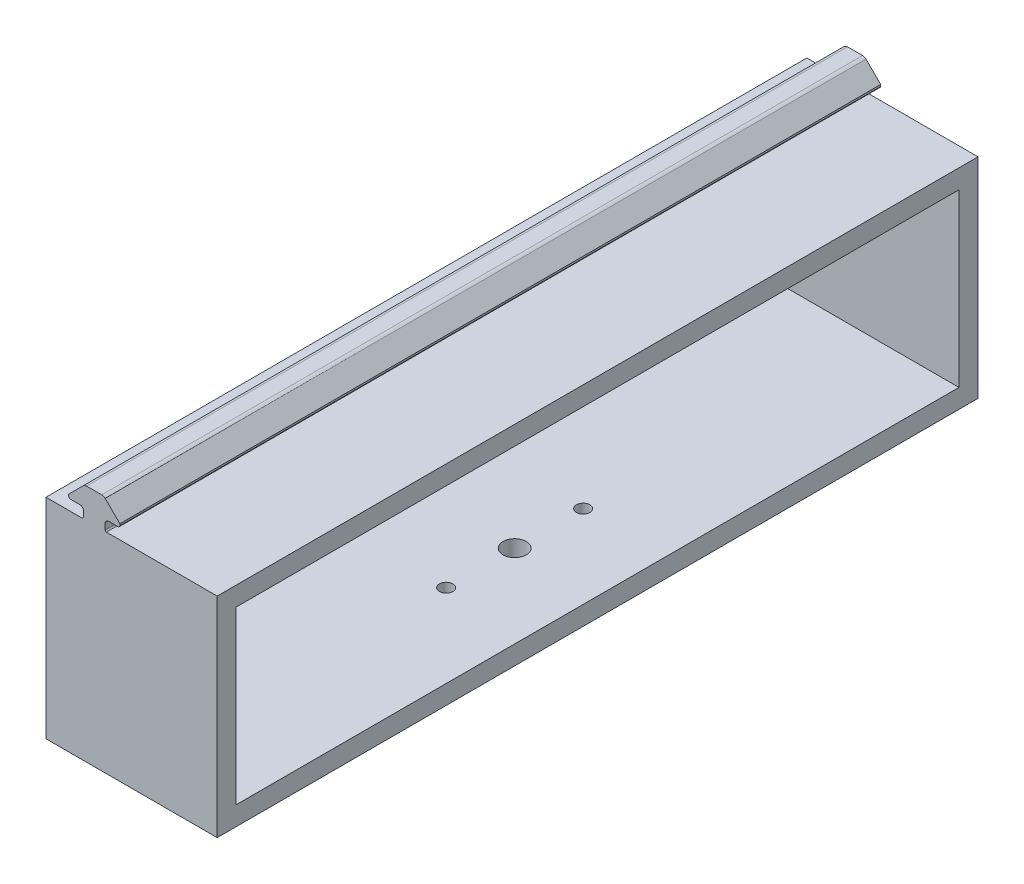
ISO-10303-21;
HEADER;
FILE_DESCRIPTION(('STEP AP214'),'2;1');
FILE_NAME('part.step','',(''),(''),'','','');
FILE_SCHEMA(('AUTOMOTIVE_DESIGN { 1 0 10303 214 1 1 1 1 }'));
ENDSEC;
DATA;
#1=APPLICATION_CONTEXT('core data for automotive mechanical design processes');
#2=APPLICATION_PROTOCOL_DEFINITION('international standard','automotive_design',2000,#1);
#3=PRODUCT_CONTEXT('',#1,'mechanical');
#4=PRODUCT('Part','Part','',(#3));
#5=PRODUCT_RELATED_PRODUCT_CATEGORY('part','',(#4));
#6=PRODUCT_DEFINITION_FORMATION('','',#4);
#7=PRODUCT_DEFINITION_CONTEXT('part definition',#1,'design');
#8=PRODUCT_DEFINITION('design','',#6,#7);
#9=PRODUCT_DEFINITION_SHAPE('','',#8);
#10=(LENGTH_UNIT() NAMED_UNIT(*) SI_UNIT(.MILLI.,.METRE.));
#11=(NAMED_UNIT(*) PLANE_ANGLE_UNIT() SI_UNIT($,.RADIAN.));
#12=(NAMED_UNIT(*) SI_UNIT($,.STERADIAN.) SOLID_ANGLE_UNIT());
#13=UNCERTAINTY_MEASURE_WITH_UNIT(LENGTH_MEASURE(1.E-05),#10,'distance_accuracy_value','');
#14=(GEOMETRIC_REPRESENTATION_CONTEXT(3) GLOBAL_UNCERTAINTY_ASSIGNED_CONTEXT((#13)) GLOBAL_UNIT_ASSIGNED_CONTEXT((#10,
#11,#12)) REPRESENTATION_CONTEXT('',''));
#15=CARTESIAN_POINT('',(0.,0.,0.));
#16=DIRECTION('',(0.,0.,1.));
#17=DIRECTION('',(1.,0.,0.));
#18=AXIS2_PLACEMENT_3D('',#15,#16,#17);
#19=CARTESIAN_POINT('',(-8.1958693909758,29.0682575839623,200.));
#20=DIRECTION('',(0.,0.,-1.));
#21=DIRECTION('',(-1.,0.,0.));
#22=AXIS2_PLACEMENT_3D('',#19,#20,#21);
#23=CYLINDRICAL_SURFACE('',#22,2.2572718680956);
#24=CARTESIAN_POINT('',(-8.1958693909758,29.0682575839623,0.));
#25=DIRECTION('',(0.,0.,1.));
#26=DIRECTION('',(-1.,0.,0.));
#27=AXIS2_PLACEMENT_3D('',#24,#25,#26);
#28=CIRCLE('',#27,2.2572718680956);
#29=CARTESIAN_POINT('',(-6.93784845917179,30.9424666495787,0.));
#30=VERTEX_POINT('',#29);
#31=CARTESIAN_POINT('',(-7.83541703649035,31.2965642025949,0.));
#32=VERTEX_POINT('',#31);
#33=EDGE_CURVE('E255',#30,#32,#28,.T.);
#34=ORIENTED_EDGE('',*,*,#33,.T.);
#35=DIRECTION('',(0.,0.,-1.));
#36=VECTOR('',#35,1.);
#37=CARTESIAN_POINT('',(-7.83541703649035,31.2965642025949,200.));
#38=LINE('',#37,#36);
#39=CARTESIAN_POINT('',(-7.83541703649035,31.2965642025949,200.));
#40=VERTEX_POINT('',#39);
#41=EDGE_CURVE('E479',#40,#32,#38,.T.);
#42=ORIENTED_EDGE('',*,*,#41,.F.);
#43=CARTESIAN_POINT('',(-8.1958693909758,29.0682575839623,200.));
#44=DIRECTION('',(0.,0.,1.));
#45=DIRECTION('',(-1.,0.,0.));
#46=AXIS2_PLACEMENT_3D('',#43,#44,#45);
#47=CIRCLE('',#46,2.2572718680956);
#48=CARTESIAN_POINT('',(-6.93784845917179,30.9424666495787,200.));
#49=VERTEX_POINT('',#48);
#50=EDGE_CURVE('E262',#49,#40,#47,.T.);
#51=ORIENTED_EDGE('',*,*,#50,.F.);
#52=DIRECTION('',(0.,0.,-1.));
#53=VECTOR('',#52,1.);
#54=CARTESIAN_POINT('',(-6.93784845917179,30.9424666495787,200.));
#55=LINE('',#54,#53);
#56=EDGE_CURVE('E330',#49,#30,#55,.T.);
#57=ORIENTED_EDGE('',*,*,#56,.T.);
#58=EDGE_LOOP('',(#34,#42,#51,#57));
#59=FACE_BOUND('',#58,.T.);
#60=ADVANCED_FACE('F45',(#59),#23,.T.);
#61=CARTESIAN_POINT('',(-11.79278840289,31.2965642025949,200.));
#62=DIRECTION('',(0.,-1.,0.));
#63=DIRECTION('',(0.,0.,-1.));
#64=AXIS2_PLACEMENT_3D('',#61,#62,#63);
#65=PLANE('',#64);
#66=DIRECTION('',(-1.,0.,0.));
#67=VECTOR('',#66,1.);
#68=CARTESIAN_POINT('',(-11.79278840289,31.2965642025949,0.));
#69=LINE('',#68,#67);
#70=CARTESIAN_POINT('',(-11.79278840289,31.2965642025949,0.));
#71=VERTEX_POINT('',#70);
#72=EDGE_CURVE('E334',#32,#71,#69,.T.);
#73=ORIENTED_EDGE('',*,*,#72,.T.);
#74=DIRECTION('',(0.,0.,-1.));
#75=VECTOR('',#74,1.);
#76=CARTESIAN_POINT('',(-11.79278840289,31.2965642025949,200.));
#77=LINE('',#76,#75);
#78=CARTESIAN_POINT('',(-11.79278840289,31.2965642025949,200.));
#79=VERTEX_POINT('',#78);
#80=EDGE_CURVE('E475',#79,#71,#77,.T.);
#81=ORIENTED_EDGE('',*,*,#80,.F.);
#82=DIRECTION('',(-1.,0.,0.));
#83=VECTOR('',#82,1.);
#84=CARTESIAN_POINT('',(-11.79278840289,31.2965642025949,200.));
#85=LINE('',#84,#83);
#86=EDGE_CURVE('E266',#40,#79,#85,.T.);
#87=ORIENTED_EDGE('',*,*,#86,.F.);
#88=ORIENTED_EDGE('',*,*,#41,.T.);
#89=EDGE_LOOP('',(#73,#81,#87,#88));
#90=FACE_BOUND('',#89,.T.);
#91=ADVANCED_FACE('F519',(#90),#65,.F.);
#92=CARTESIAN_POINT('',(-11.4323360484045,29.0682575839623,200.));
#93=DIRECTION('',(0.,0.,-1.));
#94=DIRECTION('',(-1.,0.,0.));
#95=AXIS2_PLACEMENT_3D('',#92,#93,#94);
#96=CYLINDRICAL_SURFACE('',#95,2.2572718680956);
#97=CARTESIAN_POINT('',(-11.4323360484045,29.0682575839623,0.));
#98=DIRECTION('',(0.,0.,1.));
#99=DIRECTION('',(1.,0.,0.));
#100=AXIS2_PLACEMENT_3D('',#97,#98,#99);
#101=CIRCLE('',#100,2.2572718680956);
#102=CARTESIAN_POINT('',(-12.6903569802085,30.9424666495787,0.));
#103=VERTEX_POINT('',#102);
#104=EDGE_CURVE('E337',#71,#103,#101,.T.);
#105=ORIENTED_EDGE('',*,*,#104,.T.);
#106=DIRECTION('',(0.,0.,-1.));
#107=VECTOR('',#106,1.);
#108=CARTESIAN_POINT('',(-12.6903569802085,30.9424666495787,200.));
#109=LINE('',#108,#107);
#110=CARTESIAN_POINT('',(-12.6903569802085,30.9424666495787,200.));
#111=VERTEX_POINT('',#110);
#112=EDGE_CURVE('E471',#111,#103,#109,.T.);
#113=ORIENTED_EDGE('',*,*,#112,.F.);
#114=CARTESIAN_POINT('',(-11.4323360484045,29.0682575839623,200.));
#115=DIRECTION('',(0.,0.,1.));
#116=DIRECTION('',(1.,0.,0.));
#117=AXIS2_PLACEMENT_3D('',#114,#115,#116);
#118=CIRCLE('',#117,2.2572718680956);
#119=EDGE_CURVE('E270',#79,#111,#118,.T.);
#120=ORIENTED_EDGE('',*,*,#119,.F.);
#121=ORIENTED_EDGE('',*,*,#80,.T.);
#122=EDGE_LOOP('',(#105,#113,#120,#121));
#123=FACE_BOUND('',#122,.T.);
#124=ADVANCED_FACE('F524',(#123),#96,.T.);
#125=CARTESIAN_POINT('',(-12.6903569802085,30.9424666495787,200.));
#126=DIRECTION('',(0.707106781186547,-0.707106781186547,0.));
#127=DIRECTION('',(0.707106781186548,0.707106781186548,0.));
#128=AXIS2_PLACEMENT_3D('',#125,#126,#127);
#129=PLANE('',#128);
#130=DIRECTION('',(-0.707106781186547,-0.707106781186547,0.));
#131=VECTOR('',#130,1.);
#132=CARTESIAN_POINT('',(-12.6903569802085,30.9424666495787,0.));
#133=LINE('',#132,#131);
#134=CARTESIAN_POINT('',(-16.5448242417791,27.0879993880081,0.));
#135=VERTEX_POINT('',#134);
#136=EDGE_CURVE('E340',#103,#135,#133,.T.);
#137=ORIENTED_EDGE('',*,*,#136,.T.);
#138=DIRECTION('',(0.,0.,-1.));
#139=VECTOR('',#138,1.);
#140=CARTESIAN_POINT('',(-16.5448242417791,27.0879993880081,200.));
#141=LINE('',#140,#139);
#142=CARTESIAN_POINT('',(-16.5448242417791,27.0879993880081,200.));
#143=VERTEX_POINT('',#142);
#144=EDGE_CURVE('E467',#143,#135,#141,.T.);
#145=ORIENTED_EDGE('',*,*,#144,.F.);
#146=DIRECTION('',(-0.707106781186547,-0.707106781186547,0.));
#147=VECTOR('',#146,1.);
#148=CARTESIAN_POINT('',(-12.6903569802085,30.9424666495787,200.));
#149=LINE('',#148,#147);
#150=EDGE_CURVE('E273',#111,#143,#149,.T.);
#151=ORIENTED_EDGE('',*,*,#150,.F.);
#152=ORIENTED_EDGE('',*,*,#112,.T.);
#153=EDGE_LOOP('',(#137,#145,#151,#152));
#154=FACE_BOUND('',#153,.T.);
#155=ADVANCED_FACE('F628',(#154),#129,.F.);
#156=CARTESIAN_POINT('',(-16.5448242417791,27.0879993880081,200.));
#157=DIRECTION('',(1.,0.,0.));
#158=DIRECTION('',(0.,0.,-1.));
#159=AXIS2_PLACEMENT_3D('',#156,#157,#158);
#160=PLANE('',#159);
#161=DIRECTION('',(0.,-1.,0.));
#162=VECTOR('',#161,1.);
#163=CARTESIAN_POINT('',(-16.5448242417791,27.0879993880081,0.));
#164=LINE('',#163,#162);
#165=CARTESIAN_POINT('',(-16.5448242417791,26.6272076199878,0.));
#166=VERTEX_POINT('',#165);
#167=EDGE_CURVE('E343',#135,#166,#164,.T.);
#168=ORIENTED_EDGE('',*,*,#167,.T.);
#169=DIRECTION('',(0.,0.,-1.));
#170=VECTOR('',#169,1.);
#171=CARTESIAN_POINT('',(-16.5448242417791,26.6272076199878,200.));
#172=LINE('',#171,#170);
#173=CARTESIAN_POINT('',(-16.5448242417791,26.6272076199878,200.));
#174=VERTEX_POINT('',#173);
#175=EDGE_CURVE('E463',#174,#166,#172,.T.);
#176=ORIENTED_EDGE('',*,*,#175,.F.);
#177=DIRECTION('',(0.,-1.,0.));
#178=VECTOR('',#177,1.);
#179=CARTESIAN_POINT('',(-16.5448242417791,27.0879993880081,200.));
#180=LINE('',#179,#178);
#181=EDGE_CURVE('E276',#143,#174,#180,.T.);
#182=ORIENTED_EDGE('',*,*,#181,.F.);
#183=ORIENTED_EDGE('',*,*,#144,.T.);
#184=EDGE_LOOP('',(#168,#176,#182,#183));
#185=FACE_BOUND('',#184,.T.);
#186=ADVANCED_FACE('F623',(#185),#160,.F.);
#187=CARTESIAN_POINT('',(-15.9493391101866,26.76190098356,200.));
#188=DIRECTION('',(0.,0.,-1.));
#189=DIRECTION('',(-1.,0.,0.));
#190=AXIS2_PLACEMENT_3D('',#187,#188,#189);
#191=CYLINDRICAL_SURFACE('',#190,0.610528331970121);
#192=CARTESIAN_POINT('',(-15.9493391101866,26.76190098356,0.));
#193=DIRECTION('',(0.,0.,1.));
#194=DIRECTION('',(-1.,0.,0.));
#195=AXIS2_PLACEMENT_3D('',#192,#193,#194);
#196=CIRCLE('',#195,0.610528331970121);
#197=CARTESIAN_POINT('',(-16.0840324737598,26.1664158519676,0.));
#198=VERTEX_POINT('',#197);
#199=EDGE_CURVE('E346',#166,#198,#196,.T.);
#200=ORIENTED_EDGE('',*,*,#199,.T.);
#201=DIRECTION('',(0.,0.,-1.));
#202=VECTOR('',#201,1.);
#203=CARTESIAN_POINT('',(-16.0840324737598,26.1664158519676,200.));
#204=LINE('',#203,#202);
#205=CARTESIAN_POINT('',(-16.0840324737598,26.1664158519676,200.));
#206=VERTEX_POINT('',#205);
#207=EDGE_CURVE('E459',#206,#198,#204,.T.);
#208=ORIENTED_EDGE('',*,*,#207,.F.);
#209=CARTESIAN_POINT('',(-15.9493391101866,26.76190098356,200.));
#210=DIRECTION('',(0.,0.,1.));
#211=DIRECTION('',(-1.,0.,0.));
#212=AXIS2_PLACEMENT_3D('',#209,#210,#211);
#213=CIRCLE('',#212,0.610528331970121);
#214=EDGE_CURVE('E279',#174,#206,#213,.T.);
#215=ORIENTED_EDGE('',*,*,#214,.F.);
#216=ORIENTED_EDGE('',*,*,#175,.T.);
#217=EDGE_LOOP('',(#200,#208,#215,#216));
#218=FACE_BOUND('',#217,.T.);
#219=ADVANCED_FACE('F619',(#218),#191,.T.);
#220=CARTESIAN_POINT('',(-16.0840324737598,26.1664158519676,200.));
#221=DIRECTION('',(0.,1.,0.));
#222=DIRECTION('',(0.,0.,1.));
#223=AXIS2_PLACEMENT_3D('',#220,#221,#222);
#224=PLANE('',#223);
#225=DIRECTION('',(1.,0.,0.));
#226=VECTOR('',#225,1.);
#227=CARTESIAN_POINT('',(-16.0840324737598,26.1664158519676,0.));
#228=LINE('',#227,#226);
#229=CARTESIAN_POINT('',(-13.5343180240455,26.1664158519676,0.));
#230=VERTEX_POINT('',#229);
#231=EDGE_CURVE('E349',#198,#230,#228,.T.);
#232=ORIENTED_EDGE('',*,*,#231,.T.);
#233=DIRECTION('',(0.,0.,-1.));
#234=VECTOR('',#233,1.);
#235=CARTESIAN_POINT('',(-13.5343180240455,26.1664158519676,200.));
#236=LINE('',#235,#234);
#237=CARTESIAN_POINT('',(-13.5343180240455,26.1664158519676,200.));
#238=VERTEX_POINT('',#237);
#239=EDGE_CURVE('E455',#238,#230,#236,.T.);
#240=ORIENTED_EDGE('',*,*,#239,.F.);
#241=DIRECTION('',(1.,0.,0.));
#242=VECTOR('',#241,1.);
#243=CARTESIAN_POINT('',(-16.0840324737598,26.1664158519676,200.));
#244=LINE('',#243,#242);
#245=EDGE_CURVE('E282',#206,#238,#244,.T.);
#246=ORIENTED_EDGE('',*,*,#245,.F.);
#247=ORIENTED_EDGE('',*,*,#207,.T.);
#248=EDGE_LOOP('',(#232,#240,#246,#247));
#249=FACE_BOUND('',#248,.T.);
#250=ADVANCED_FACE('F615',(#249),#224,.F.);
#251=CARTESIAN_POINT('',(-13.5577695445467,25.2990032876291,200.));
#252=DIRECTION('',(0.,0.,-1.));
#253=DIRECTION('',(-1.,0.,0.));
#254=AXIS2_PLACEMENT_3D('',#251,#252,#253);
#255=CYLINDRICAL_SURFACE('',#254,0.867729526169411);
#256=CARTESIAN_POINT('',(-13.5577695445467,25.2990032876291,0.));
#257=DIRECTION('',(0.,0.,-1.));
#258=DIRECTION('',(-1.,0.,0.));
#259=AXIS2_PLACEMENT_3D('',#256,#257,#258);
#260=CIRCLE('',#259,0.867729526169411);
#261=CARTESIAN_POINT('',(-12.6903569802084,25.3224548081423,0.));
#262=VERTEX_POINT('',#261);
#263=EDGE_CURVE('E352',#230,#262,#260,.T.);
#264=ORIENTED_EDGE('',*,*,#263,.T.);
#265=DIRECTION('',(0.,0.,-1.));
#266=VECTOR('',#265,1.);
#267=CARTESIAN_POINT('',(-12.6903569802084,25.3224548081423,200.));
#268=LINE('',#267,#266);
#269=CARTESIAN_POINT('',(-12.6903569802084,25.3224548081423,200.));
#270=VERTEX_POINT('',#269);
#271=EDGE_CURVE('E451',#270,#262,#268,.T.);
#272=ORIENTED_EDGE('',*,*,#271,.F.);
#273=CARTESIAN_POINT('',(-13.5577695445467,25.2990032876291,200.));
#274=DIRECTION('',(0.,0.,-1.));
#275=DIRECTION('',(-1.,0.,0.));
#276=AXIS2_PLACEMENT_3D('',#273,#274,#275);
#277=CIRCLE('',#276,0.867729526169411);
#278=EDGE_CURVE('E285',#238,#270,#277,.T.);
#279=ORIENTED_EDGE('',*,*,#278,.F.);
#280=ORIENTED_EDGE('',*,*,#239,.T.);
#281=EDGE_LOOP('',(#264,#272,#279,#280));
#282=FACE_BOUND('',#281,.T.);
#283=ADVANCED_FACE('F610',(#282),#255,.F.);
#284=CARTESIAN_POINT('',(-12.6903569802084,25.3224548081423,200.));
#285=DIRECTION('',(1.,0.,0.));
#286=DIRECTION('',(0.,0.,-1.));
#287=AXIS2_PLACEMENT_3D('',#284,#285,#286);
#288=PLANE('',#287);
#289=DIRECTION('',(0.,-1.,0.));
#290=VECTOR('',#289,1.);
#291=CARTESIAN_POINT('',(-12.6903569802084,25.3224548081423,0.));
#292=LINE('',#291,#290);
#293=CARTESIAN_POINT('',(-12.6903569802084,23.7712461375488,0.));
#294=VERTEX_POINT('',#293);
#295=EDGE_CURVE('E355',#262,#294,#292,.T.);
#296=ORIENTED_EDGE('',*,*,#295,.T.);
#297=DIRECTION('',(0.,0.,-1.));
#298=VECTOR('',#297,1.);
#299=CARTESIAN_POINT('',(-12.6903569802084,23.7712461375488,200.));
#300=LINE('',#299,#298);
#301=CARTESIAN_POINT('',(-12.6903569802084,23.7712461375488,200.));
#302=VERTEX_POINT('',#301);
#303=EDGE_CURVE('E447',#302,#294,#300,.T.);
#304=ORIENTED_EDGE('',*,*,#303,.F.);
#305=DIRECTION('',(0.,-1.,0.));
#306=VECTOR('',#305,1.);
#307=CARTESIAN_POINT('',(-12.6903569802084,25.3224548081423,200.));
#308=LINE('',#307,#306);
#309=EDGE_CURVE('E288',#270,#302,#308,.T.);
#310=ORIENTED_EDGE('',*,*,#309,.F.);
#311=ORIENTED_EDGE('',*,*,#271,.T.);
#312=EDGE_LOOP('',(#296,#304,#310,#311));
#313=FACE_BOUND('',#312,.T.);
#314=ADVANCED_FACE('F604',(#313),#288,.F.);
#315=CARTESIAN_POINT('',(-13.069533531626,23.7783799229022,200.));
#316=DIRECTION('',(0.,0.,-1.));
#317=DIRECTION('',(-1.,0.,0.));
#318=AXIS2_PLACEMENT_3D('',#315,#316,#317);
#319=CYLINDRICAL_SURFACE('',#318,0.379243652601272);
#320=CARTESIAN_POINT('',(-13.069533531626,23.7783799229022,0.));
#321=DIRECTION('',(0.,0.,-1.));
#322=DIRECTION('',(-1.,0.,0.));
#323=AXIS2_PLACEMENT_3D('',#320,#321,#322);
#324=CIRCLE('',#323,0.379243652601272);
#325=CARTESIAN_POINT('',(-12.9823764886323,23.4092872544638,0.));
#326=VERTEX_POINT('',#325);
#327=EDGE_CURVE('E358',#294,#326,#324,.T.);
#328=ORIENTED_EDGE('',*,*,#327,.T.);
#329=DIRECTION('',(0.,0.,-1.));
#330=VECTOR('',#329,1.);
#331=CARTESIAN_POINT('',(-12.9823764886323,23.4092872544638,200.));
#332=LINE('',#331,#330);
#333=CARTESIAN_POINT('',(-12.9823764886323,23.4092872544638,200.));
#334=VERTEX_POINT('',#333);
#335=EDGE_CURVE('E443',#334,#326,#332,.T.);
#336=ORIENTED_EDGE('',*,*,#335,.F.);
#337=CARTESIAN_POINT('',(-13.069533531626,23.7783799229022,200.));
#338=DIRECTION('',(0.,0.,-1.));
#339=DIRECTION('',(-1.,0.,0.));
#340=AXIS2_PLACEMENT_3D('',#337,#338,#339);
#341=CIRCLE('',#340,0.379243652601272);
#342=EDGE_CURVE('E291',#302,#334,#341,.T.);
#343=ORIENTED_EDGE('',*,*,#342,.F.);
#344=ORIENTED_EDGE('',*,*,#303,.T.);
#345=EDGE_LOOP('',(#328,#336,#343,#344));
#346=FACE_BOUND('',#345,.T.);
#347=ADVANCED_FACE('F600',(#346),#319,.F.);
#348=CARTESIAN_POINT('',(-12.9823764886323,23.4092872544638,200.));
#349=DIRECTION('',(0.,-1.,0.));
#350=DIRECTION('',(0.,0.,-1.));
#351=AXIS2_PLACEMENT_3D('',#348,#349,#350);
#352=PLANE('',#351);
#353=DIRECTION('',(-1.,0.,0.));
#354=VECTOR('',#353,1.);
#355=CARTESIAN_POINT('',(-12.9823764886323,23.4092872544638,0.));
#356=LINE('',#355,#354);
#357=CARTESIAN_POINT('',(-22.5,23.4092872544638,0.));
#358=VERTEX_POINT('',#357);
#359=EDGE_CURVE('E361',#326,#358,#356,.T.);
#360=ORIENTED_EDGE('',*,*,#359,.T.);
#361=DIRECTION('',(0.,0.,-1.));
#362=VECTOR('',#361,1.);
#363=CARTESIAN_POINT('',(-22.5,23.4092872544638,200.));
#364=LINE('',#363,#362);
#365=CARTESIAN_POINT('',(-22.5,23.4092872544638,200.));
#366=VERTEX_POINT('',#365);
#367=EDGE_CURVE('E439',#366,#358,#364,.T.);
#368=ORIENTED_EDGE('',*,*,#367,.F.);
#369=DIRECTION('',(-1.,0.,0.));
#370=VECTOR('',#369,1.);
#371=CARTESIAN_POINT('',(-12.9823764886323,23.4092872544638,200.));
#372=LINE('',#371,#370);
#373=EDGE_CURVE('E294',#334,#366,#372,.T.);
#374=ORIENTED_EDGE('',*,*,#373,.F.);
#375=ORIENTED_EDGE('',*,*,#335,.T.);
#376=EDGE_LOOP('',(#360,#368,#374,#375));
#377=FACE_BOUND('',#376,.T.);
#378=ADVANCED_FACE('F595',(#377),#352,.F.);
#379=CARTESIAN_POINT('',(-22.5,23.4092872544638,200.));
#380=DIRECTION('',(1.,0.,0.));
#381=DIRECTION('',(0.,0.,-1.));
#382=AXIS2_PLACEMENT_3D('',#379,#380,#381);
#383=PLANE('',#382);
#384=DIRECTION('',(0.,0.,-1.));
#385=VECTOR('',#384,1.);
#386=CARTESIAN_POINT('',(-22.5,-26.5907127455362,195.));
#387=LINE('',#386,#385);
#388=CARTESIAN_POINT('',(-22.5,-26.5907127455362,195.));
#389=VERTEX_POINT('',#388);
#390=CARTESIAN_POINT('',(-22.5,-26.5907127455362,5.00000000000005));
#391=VERTEX_POINT('',#390);
#392=EDGE_CURVE('E228',#389,#391,#387,.T.);
#393=ORIENTED_EDGE('',*,*,#392,.T.);
#394=DIRECTION('',(0.,1.,0.));
#395=VECTOR('',#394,1.);
#396=CARTESIAN_POINT('',(-22.5,-26.5907127455362,5.00000000000005));
#397=LINE('',#396,#395);
#398=CARTESIAN_POINT('',(-22.5,18.4092872544638,5.00000000000005));
#399=VERTEX_POINT('',#398);
#400=EDGE_CURVE('E223',#391,#399,#397,.T.);
#401=ORIENTED_EDGE('',*,*,#400,.T.);
#402=DIRECTION('',(0.,0.,1.));
#403=VECTOR('',#402,1.);
#404=CARTESIAN_POINT('',(-22.5,18.4092872544638,195.));
#405=LINE('',#404,#403);
#406=CARTESIAN_POINT('',(-22.5,18.4092872544638,195.));
#407=VERTEX_POINT('',#406);
#408=EDGE_CURVE('E231',#399,#407,#405,.T.);
#409=ORIENTED_EDGE('',*,*,#408,.T.);
#410=DIRECTION('',(0.,-1.,0.));
#411=VECTOR('',#410,1.);
#412=CARTESIAN_POINT('',(-22.5,-26.5907127455362,195.));
#413=LINE('',#412,#411);
#414=EDGE_CURVE('E62',#407,#389,#413,.T.);
#415=ORIENTED_EDGE('',*,*,#414,.T.);
#416=EDGE_LOOP('',(#393,#401,#409,#415));
#417=FACE_BOUND('',#416,.T.);
#418=DIRECTION('',(0.,-1.,0.));
#419=VECTOR('',#418,1.);
#420=CARTESIAN_POINT('',(-22.5,23.4092872544638,0.));
#421=LINE('',#420,#419);
#422=CARTESIAN_POINT('',(-22.5,-31.5907127455362,0.));
#423=VERTEX_POINT('',#422);
#424=EDGE_CURVE('E364',#358,#423,#421,.T.);
#425=ORIENTED_EDGE('',*,*,#424,.T.);
#426=DIRECTION('',(0.,0.,-1.));
#427=VECTOR('',#426,1.);
#428=CARTESIAN_POINT('',(-22.5,-31.5907127455362,200.));
#429=LINE('',#428,#427);
#430=CARTESIAN_POINT('',(-22.5,-31.5907127455362,200.));
#431=VERTEX_POINT('',#430);
#432=EDGE_CURVE('E435',#431,#423,#429,.T.);
#433=ORIENTED_EDGE('',*,*,#432,.F.);
#434=DIRECTION('',(0.,-1.,0.));
#435=VECTOR('',#434,1.);
#436=CARTESIAN_POINT('',(-22.5,23.4092872544638,200.));
#437=LINE('',#436,#435);
#438=EDGE_CURVE('E297',#366,#431,#437,.T.);
#439=ORIENTED_EDGE('',*,*,#438,.F.);
#440=ORIENTED_EDGE('',*,*,#367,.T.);
#441=EDGE_LOOP('',(#425,#433,#439,#440));
#442=FACE_BOUND('',#441,.T.);
#443=ADVANCED_FACE('F236',(#417,#442),#383,.F.);
#444=CARTESIAN_POINT('',(-22.5,-31.5907127455362,200.));
#445=DIRECTION('',(0.,1.,0.));
#446=DIRECTION('',(0.,0.,1.));
#447=AXIS2_PLACEMENT_3D('',#444,#445,#446);
#448=PLANE('',#447);
#449=CARTESIAN_POINT('',(0.69633687184546,-31.5907127455362,117.999941546123));
#450=DIRECTION('',(0.,-1.,0.));
#451=DIRECTION('',(0.,0.,-1.));
#452=AXIS2_PLACEMENT_3D('',#449,#450,#451);
#453=CIRCLE('',#452,1.76450000000001);
#454=CARTESIAN_POINT('',(0.69633687184546,-31.5907127455362,116.235441546123));
#455=VERTEX_POINT('',#454);
#456=EDGE_CURVE('E875',#455,#455,#453,.T.);
#457=ORIENTED_EDGE('',*,*,#456,.F.);
#458=EDGE_LOOP('',(#457));
#459=FACE_BOUND('',#458,.T.);
#460=CARTESIAN_POINT('',(0.696336871845469,-31.5907127455362,81.9999415461228));
#461=DIRECTION('',(0.,-1.,0.));
#462=DIRECTION('',(0.,0.,-1.));
#463=AXIS2_PLACEMENT_3D('',#460,#461,#462);
#464=CIRCLE('',#463,1.76450000000001);
#465=CARTESIAN_POINT('',(0.696336871845469,-31.5907127455362,80.2354415461228));
#466=VERTEX_POINT('',#465);
#467=EDGE_CURVE('E878',#466,#466,#464,.T.);
#468=ORIENTED_EDGE('',*,*,#467,.F.);
#469=EDGE_LOOP('',(#468));
#470=FACE_BOUND('',#469,.T.);
#471=CARTESIAN_POINT('',(0.699999999999993,-31.5907127455362,100.));
#472=DIRECTION('',(0.,-1.,0.));
#473=DIRECTION('',(0.,0.,-1.));
#474=AXIS2_PLACEMENT_3D('',#471,#472,#473);
#475=CIRCLE('',#474,3.05778);
#476=CARTESIAN_POINT('',(0.699999999999993,-31.5907127455362,96.94222));
#477=VERTEX_POINT('',#476);
#478=EDGE_CURVE('E245',#477,#477,#475,.T.);
#479=ORIENTED_EDGE('',*,*,#478,.F.);
#480=EDGE_LOOP('',(#479));
#481=FACE_BOUND('',#480,.T.);
#482=DIRECTION('',(1.,0.,0.));
#483=VECTOR('',#482,1.);
#484=CARTESIAN_POINT('',(-22.5,-31.5907127455362,0.));
#485=LINE('',#484,#483);
#486=CARTESIAN_POINT('',(22.5,-31.5907127455362,0.));
#487=VERTEX_POINT('',#486);
#488=EDGE_CURVE('E367',#423,#487,#485,.T.);
#489=ORIENTED_EDGE('',*,*,#488,.T.);
#490=DIRECTION('',(0.,0.,-1.));
#491=VECTOR('',#490,1.);
#492=CARTESIAN_POINT('',(22.5,-31.5907127455362,200.));
#493=LINE('',#492,#491);
#494=CARTESIAN_POINT('',(22.5,-31.5907127455362,200.));
#495=VERTEX_POINT('',#494);
#496=EDGE_CURVE('E431',#495,#487,#493,.T.);
#497=ORIENTED_EDGE('',*,*,#496,.F.);
#498=DIRECTION('',(1.,0.,0.));
#499=VECTOR('',#498,1.);
#500=CARTESIAN_POINT('',(-22.5,-31.5907127455362,200.));
#501=LINE('',#500,#499);
#502=EDGE_CURVE('E300',#431,#495,#501,.T.);
#503=ORIENTED_EDGE('',*,*,#502,.F.);
#504=ORIENTED_EDGE('',*,*,#432,.T.);
#505=EDGE_LOOP('',(#489,#497,#503,#504));
#506=FACE_BOUND('',#505,.T.);
#507=ADVANCED_FACE('F587',(#459,#470,#481,#506),#448,.F.);
#508=CARTESIAN_POINT('',(22.5,-31.5907127455362,200.));
#509=DIRECTION('',(-1.,0.,0.));
#510=DIRECTION('',(0.,0.,1.));
#511=AXIS2_PLACEMENT_3D('',#508,#509,#510);
#512=PLANE('',#511);
#513=DIRECTION('',(0.,0.,-1.));
#514=VECTOR('',#513,1.);
#515=CARTESIAN_POINT('',(22.5,18.4092872544638,200.));
#516=LINE('',#515,#514);
#517=CARTESIAN_POINT('',(22.5,18.4092872544638,195.));
#518=VERTEX_POINT('',#517);
#519=CARTESIAN_POINT('',(22.5,18.4092872544638,5.00000000000006));
#520=VERTEX_POINT('',#519);
#521=EDGE_CURVE('E483',#518,#520,#516,.T.);
#522=ORIENTED_EDGE('',*,*,#521,.T.);
#523=DIRECTION('',(0.,-1.,0.));
#524=VECTOR('',#523,1.);
#525=CARTESIAN_POINT('',(22.5,-31.5907127455362,5.00000000000006));
#526=LINE('',#525,#524);
#527=CARTESIAN_POINT('',(22.5,-26.5907127455362,5.00000000000005));
#528=VERTEX_POINT('',#527);
#529=EDGE_CURVE('E11',#520,#528,#526,.T.);
#530=ORIENTED_EDGE('',*,*,#529,.T.);
#531=DIRECTION('',(0.,0.,1.));
#532=VECTOR('',#531,1.);
#533=CARTESIAN_POINT('',(22.5,-26.5907127455362,200.));
#534=LINE('',#533,#532);
#535=CARTESIAN_POINT('',(22.5,-26.5907127455362,195.));
#536=VERTEX_POINT('',#535);
#537=EDGE_CURVE('E54',#528,#536,#534,.T.);
#538=ORIENTED_EDGE('',*,*,#537,.T.);
#539=DIRECTION('',(0.,1.,0.));
#540=VECTOR('',#539,1.);
#541=CARTESIAN_POINT('',(22.5,-31.5907127455362,195.));
#542=LINE('',#541,#540);
#543=EDGE_CURVE('E486',#536,#518,#542,.T.);
#544=ORIENTED_EDGE('',*,*,#543,.T.);
#545=EDGE_LOOP('',(#522,#530,#538,#544));
#546=FACE_BOUND('',#545,.T.);
#547=DIRECTION('',(0.,1.,0.));
#548=VECTOR('',#547,1.);
#549=CARTESIAN_POINT('',(22.5,-31.5907127455362,0.));
#550=LINE('',#549,#548);
#551=CARTESIAN_POINT('',(22.5,23.4092872544638,0.));
#552=VERTEX_POINT('',#551);
#553=EDGE_CURVE('E370',#487,#552,#550,.T.);
#554=ORIENTED_EDGE('',*,*,#553,.T.);
#555=DIRECTION('',(0.,0.,-1.));
#556=VECTOR('',#555,1.);
#557=CARTESIAN_POINT('',(22.5,23.4092872544638,200.));
#558=LINE('',#557,#556);
#559=CARTESIAN_POINT('',(22.5,23.4092872544638,200.));
#560=VERTEX_POINT('',#559);
#561=EDGE_CURVE('E427',#560,#552,#558,.T.);
#562=ORIENTED_EDGE('',*,*,#561,.F.);
#563=DIRECTION('',(0.,1.,0.));
#564=VECTOR('',#563,1.);
#565=CARTESIAN_POINT('',(22.5,-31.5907127455362,200.));
#566=LINE('',#565,#564);
#567=EDGE_CURVE('E303',#495,#560,#566,.T.);
#568=ORIENTED_EDGE('',*,*,#567,.F.);
#569=ORIENTED_EDGE('',*,*,#496,.T.);
#570=EDGE_LOOP('',(#554,#562,#568,#569));
#571=FACE_BOUND('',#570,.T.);
#572=ADVANCED_FACE('F582',(#546,#571),#512,.F.);
#573=CARTESIAN_POINT('',(22.5,23.4092872544638,200.));
#574=DIRECTION('',(0.,-1.,0.));
#575=DIRECTION('',(0.,0.,-1.));
#576=AXIS2_PLACEMENT_3D('',#573,#574,#575);
#577=PLANE('',#576);
#578=DIRECTION('',(-1.,0.,0.));
#579=VECTOR('',#578,1.);
#580=CARTESIAN_POINT('',(22.5,23.4092872544638,0.));
#581=LINE('',#580,#579);
#582=CARTESIAN_POINT('',(-6.64582895074798,23.4092872544638,0.));
#583=VERTEX_POINT('',#582);
#584=EDGE_CURVE('E373',#552,#583,#581,.T.);
#585=ORIENTED_EDGE('',*,*,#584,.T.);
#586=DIRECTION('',(0.,0.,-1.));
#587=VECTOR('',#586,1.);
#588=CARTESIAN_POINT('',(-6.64582895074798,23.4092872544638,200.));
#589=LINE('',#588,#587);
#590=CARTESIAN_POINT('',(-6.64582895074798,23.4092872544638,200.));
#591=VERTEX_POINT('',#590);
#592=EDGE_CURVE('E423',#591,#583,#589,.T.);
#593=ORIENTED_EDGE('',*,*,#592,.F.);
#594=DIRECTION('',(-1.,0.,0.));
#595=VECTOR('',#594,1.);
#596=CARTESIAN_POINT('',(22.5,23.4092872544638,200.));
#597=LINE('',#596,#595);
#598=EDGE_CURVE('E306',#560,#591,#597,.T.);
#599=ORIENTED_EDGE('',*,*,#598,.F.);
#600=ORIENTED_EDGE('',*,*,#561,.T.);
#601=EDGE_LOOP('',(#585,#593,#599,#600));
#602=FACE_BOUND('',#601,.T.);
#603=ADVANCED_FACE('F576',(#602),#577,.F.);
#604=CARTESIAN_POINT('',(-6.55867190775435,23.7783799229022,200.));
#605=DIRECTION('',(0.,0.,-1.));
#606=DIRECTION('',(-1.,0.,0.));
#607=AXIS2_PLACEMENT_3D('',#604,#605,#606);
#608=CYLINDRICAL_SURFACE('',#607,0.379243652601272);
#609=CARTESIAN_POINT('',(-6.55867190775435,23.7783799229022,0.));
#610=DIRECTION('',(0.,0.,-1.));
#611=DIRECTION('',(1.,0.,0.));
#612=AXIS2_PLACEMENT_3D('',#609,#610,#611);
#613=CIRCLE('',#612,0.379243652601272);
#614=CARTESIAN_POINT('',(-6.93784845917188,23.7712461375488,0.));
#615=VERTEX_POINT('',#614);
#616=EDGE_CURVE('E376',#583,#615,#613,.T.);
#617=ORIENTED_EDGE('',*,*,#616,.T.);
#618=DIRECTION('',(0.,0.,-1.));
#619=VECTOR('',#618,1.);
#620=CARTESIAN_POINT('',(-6.93784845917188,23.7712461375488,200.));
#621=LINE('',#620,#619);
#622=CARTESIAN_POINT('',(-6.93784845917188,23.7712461375488,200.));
#623=VERTEX_POINT('',#622);
#624=EDGE_CURVE('E419',#623,#615,#621,.T.);
#625=ORIENTED_EDGE('',*,*,#624,.F.);
#626=CARTESIAN_POINT('',(-6.55867190775435,23.7783799229022,200.));
#627=DIRECTION('',(0.,0.,-1.));
#628=DIRECTION('',(1.,0.,0.));
#629=AXIS2_PLACEMENT_3D('',#626,#627,#628);
#630=CIRCLE('',#629,0.379243652601272);
#631=EDGE_CURVE('E309',#591,#623,#630,.T.);
#632=ORIENTED_EDGE('',*,*,#631,.F.);
#633=ORIENTED_EDGE('',*,*,#592,.T.);
#634=EDGE_LOOP('',(#617,#625,#632,#633));
#635=FACE_BOUND('',#634,.T.);
#636=ADVANCED_FACE('F572',(#635),#608,.F.);
#637=CARTESIAN_POINT('',(-6.93784845917188,25.3224548081423,200.));
#638=DIRECTION('',(-1.,0.,0.));
#639=DIRECTION('',(0.,0.,1.));
#640=AXIS2_PLACEMENT_3D('',#637,#638,#639);
#641=PLANE('',#640);
#642=DIRECTION('',(0.,1.,0.));
#643=VECTOR('',#642,1.);
#644=CARTESIAN_POINT('',(-6.93784845917188,25.3224548081423,0.));
#645=LINE('',#644,#643);
#646=CARTESIAN_POINT('',(-6.93784845917188,25.3224548081423,0.));
#647=VERTEX_POINT('',#646);
#648=EDGE_CURVE('E379',#615,#647,#645,.T.);
#649=ORIENTED_EDGE('',*,*,#648,.T.);
#650=DIRECTION('',(0.,0.,-1.));
#651=VECTOR('',#650,1.);
#652=CARTESIAN_POINT('',(-6.93784845917188,25.3224548081423,200.));
#653=LINE('',#652,#651);
#654=CARTESIAN_POINT('',(-6.93784845917188,25.3224548081423,200.));
#655=VERTEX_POINT('',#654);
#656=EDGE_CURVE('E415',#655,#647,#653,.T.);
#657=ORIENTED_EDGE('',*,*,#656,.F.);
#658=DIRECTION('',(0.,1.,0.));
#659=VECTOR('',#658,1.);
#660=CARTESIAN_POINT('',(-6.93784845917188,25.3224548081423,200.));
#661=LINE('',#660,#659);
#662=EDGE_CURVE('E312',#623,#655,#661,.T.);
#663=ORIENTED_EDGE('',*,*,#662,.F.);
#664=ORIENTED_EDGE('',*,*,#624,.T.);
#665=EDGE_LOOP('',(#649,#657,#663,#664));
#666=FACE_BOUND('',#665,.T.);
#667=ADVANCED_FACE('F567',(#666),#641,.F.);
#668=CARTESIAN_POINT('',(-6.07043589483366,25.2990032876291,200.));
#669=DIRECTION('',(0.,0.,-1.));
#670=DIRECTION('',(-1.,0.,0.));
#671=AXIS2_PLACEMENT_3D('',#668,#669,#670);
#672=CYLINDRICAL_SURFACE('',#671,0.867729526169411);
#673=CARTESIAN_POINT('',(-6.07043589483366,25.2990032876291,0.));
#674=DIRECTION('',(0.,0.,-1.));
#675=DIRECTION('',(1.,0.,0.));
#676=AXIS2_PLACEMENT_3D('',#673,#674,#675);
#677=CIRCLE('',#676,0.867729526169411);
#678=CARTESIAN_POINT('',(-6.09388741533486,26.1664158519676,0.));
#679=VERTEX_POINT('',#678);
#680=EDGE_CURVE('E382',#647,#679,#677,.T.);
#681=ORIENTED_EDGE('',*,*,#680,.T.);
#682=DIRECTION('',(0.,0.,-1.));
#683=VECTOR('',#682,1.);
#684=CARTESIAN_POINT('',(-6.09388741533486,26.1664158519676,200.));
#685=LINE('',#684,#683);
#686=CARTESIAN_POINT('',(-6.09388741533486,26.1664158519676,200.));
#687=VERTEX_POINT('',#686);
#688=EDGE_CURVE('E411',#687,#679,#685,.T.);
#689=ORIENTED_EDGE('',*,*,#688,.F.);
#690=CARTESIAN_POINT('',(-6.07043589483366,25.2990032876291,200.));
#691=DIRECTION('',(0.,0.,-1.));
#692=DIRECTION('',(1.,0.,0.));
#693=AXIS2_PLACEMENT_3D('',#690,#691,#692);
#694=CIRCLE('',#693,0.867729526169411);
#695=EDGE_CURVE('E315',#655,#687,#694,.T.);
#696=ORIENTED_EDGE('',*,*,#695,.F.);
#697=ORIENTED_EDGE('',*,*,#656,.T.);
#698=EDGE_LOOP('',(#681,#689,#696,#697));
#699=FACE_BOUND('',#698,.T.);
#700=ADVANCED_FACE('F561',(#699),#672,.F.);
#701=CARTESIAN_POINT('',(-3.54417296562052,26.1664158519676,200.));
#702=DIRECTION('',(0.,1.,0.));
#703=DIRECTION('',(0.,0.,1.));
#704=AXIS2_PLACEMENT_3D('',#701,#702,#703);
#705=PLANE('',#704);
#706=DIRECTION('',(1.,0.,0.));
#707=VECTOR('',#706,1.);
#708=CARTESIAN_POINT('',(-3.54417296562052,26.1664158519676,0.));
#709=LINE('',#708,#707);
#710=CARTESIAN_POINT('',(-3.54417296562052,26.1664158519676,0.));
#711=VERTEX_POINT('',#710);
#712=EDGE_CURVE('E385',#679,#711,#709,.T.);
#713=ORIENTED_EDGE('',*,*,#712,.T.);
#714=DIRECTION('',(0.,0.,-1.));
#715=VECTOR('',#714,1.);
#716=CARTESIAN_POINT('',(-3.54417296562052,26.1664158519676,200.));
#717=LINE('',#716,#715);
#718=CARTESIAN_POINT('',(-3.54417296562052,26.1664158519676,200.));
#719=VERTEX_POINT('',#718);
#720=EDGE_CURVE('E407',#719,#711,#717,.T.);
#721=ORIENTED_EDGE('',*,*,#720,.F.);
#722=DIRECTION('',(1.,0.,0.));
#723=VECTOR('',#722,1.);
#724=CARTESIAN_POINT('',(-3.54417296562052,26.1664158519676,200.));
#725=LINE('',#724,#723);
#726=EDGE_CURVE('E318',#687,#719,#725,.T.);
#727=ORIENTED_EDGE('',*,*,#726,.F.);
#728=ORIENTED_EDGE('',*,*,#688,.T.);
#729=EDGE_LOOP('',(#713,#721,#727,#728));
#730=FACE_BOUND('',#729,.T.);
#731=ADVANCED_FACE('F557',(#730),#705,.F.);
#732=CARTESIAN_POINT('',(-3.67886632919375,26.76190098356,200.));
#733=DIRECTION('',(0.,0.,-1.));
#734=DIRECTION('',(-1.,0.,0.));
#735=AXIS2_PLACEMENT_3D('',#732,#733,#734);
#736=CYLINDRICAL_SURFACE('',#735,0.610528331970122);
#737=CARTESIAN_POINT('',(-3.67886632919375,26.76190098356,0.));
#738=DIRECTION('',(0.,0.,1.));
#739=DIRECTION('',(1.,0.,0.));
#740=AXIS2_PLACEMENT_3D('',#737,#738,#739);
#741=CIRCLE('',#740,0.610528331970122);
#742=CARTESIAN_POINT('',(-3.08338119760117,26.6272076199878,0.));
#743=VERTEX_POINT('',#742);
#744=EDGE_CURVE('E388',#711,#743,#741,.T.);
#745=ORIENTED_EDGE('',*,*,#744,.T.);
#746=DIRECTION('',(0.,0.,-1.));
#747=VECTOR('',#746,1.);
#748=CARTESIAN_POINT('',(-3.08338119760117,26.6272076199878,200.));
#749=LINE('',#748,#747);
#750=CARTESIAN_POINT('',(-3.08338119760117,26.6272076199878,200.));
#751=VERTEX_POINT('',#750);
#752=EDGE_CURVE('E403',#751,#743,#749,.T.);
#753=ORIENTED_EDGE('',*,*,#752,.F.);
#754=CARTESIAN_POINT('',(-3.67886632919375,26.76190098356,200.));
#755=DIRECTION('',(0.,0.,1.));
#756=DIRECTION('',(1.,0.,0.));
#757=AXIS2_PLACEMENT_3D('',#754,#755,#756);
#758=CIRCLE('',#757,0.610528331970122);
#759=EDGE_CURVE('E321',#719,#751,#758,.T.);
#760=ORIENTED_EDGE('',*,*,#759,.F.);
#761=ORIENTED_EDGE('',*,*,#720,.T.);
#762=EDGE_LOOP('',(#745,#753,#760,#761));
#763=FACE_BOUND('',#762,.T.);
#764=ADVANCED_FACE('F552',(#763),#736,.T.);
#765=CARTESIAN_POINT('',(-3.08338119760117,27.0879993880081,200.));
#766=DIRECTION('',(-1.,0.,0.));
#767=DIRECTION('',(0.,0.,1.));
#768=AXIS2_PLACEMENT_3D('',#765,#766,#767);
#769=PLANE('',#768);
#770=DIRECTION('',(0.,1.,0.));
#771=VECTOR('',#770,1.);
#772=CARTESIAN_POINT('',(-3.08338119760117,27.0879993880081,0.));
#773=LINE('',#772,#771);
#774=CARTESIAN_POINT('',(-3.08338119760117,27.0879993880081,0.));
#775=VERTEX_POINT('',#774);
#776=EDGE_CURVE('E391',#743,#775,#773,.T.);
#777=ORIENTED_EDGE('',*,*,#776,.T.);
#778=DIRECTION('',(0.,0.,-1.));
#779=VECTOR('',#778,1.);
#780=CARTESIAN_POINT('',(-3.08338119760117,27.0879993880081,200.));
#781=LINE('',#780,#779);
#782=CARTESIAN_POINT('',(-3.08338119760117,27.0879993880081,200.));
#783=VERTEX_POINT('',#782);
#784=EDGE_CURVE('E399',#783,#775,#781,.T.);
#785=ORIENTED_EDGE('',*,*,#784,.F.);
#786=DIRECTION('',(0.,1.,0.));
#787=VECTOR('',#786,1.);
#788=CARTESIAN_POINT('',(-3.08338119760117,27.0879993880081,200.));
#789=LINE('',#788,#787);
#790=EDGE_CURVE('E324',#751,#783,#789,.T.);
#791=ORIENTED_EDGE('',*,*,#790,.F.);
#792=ORIENTED_EDGE('',*,*,#752,.T.);
#793=EDGE_LOOP('',(#777,#785,#791,#792));
#794=FACE_BOUND('',#793,.T.);
#795=ADVANCED_FACE('F546',(#794),#769,.F.);
#796=CARTESIAN_POINT('',(-6.93784845917179,30.9424666495787,200.));
#797=DIRECTION('',(-0.707106781186547,-0.707106781186547,0.));
#798=DIRECTION('',(0.707106781186548,-0.707106781186548,0.));
#799=AXIS2_PLACEMENT_3D('',#796,#797,#798);
#800=PLANE('',#799);
#801=DIRECTION('',(-0.707106781186547,0.707106781186547,0.));
#802=VECTOR('',#801,1.);
#803=CARTESIAN_POINT('',(-6.93784845917179,30.9424666495787,0.));
#804=LINE('',#803,#802);
#805=EDGE_CURVE('E267',#775,#30,#804,.T.);
#806=ORIENTED_EDGE('',*,*,#805,.T.);
#807=ORIENTED_EDGE('',*,*,#56,.F.);
#808=DIRECTION('',(-0.707106781186547,0.707106781186547,0.));
#809=VECTOR('',#808,1.);
#810=CARTESIAN_POINT('',(-6.93784845917179,30.9424666495787,200.));
#811=LINE('',#810,#809);
#812=EDGE_CURVE('E327',#783,#49,#811,.T.);
#813=ORIENTED_EDGE('',*,*,#812,.F.);
#814=ORIENTED_EDGE('',*,*,#784,.T.);
#815=EDGE_LOOP('',(#806,#807,#813,#814));
#816=FACE_BOUND('',#815,.T.);
#817=ADVANCED_FACE('F544',(#816),#800,.F.);
#818=CARTESIAN_POINT('',(-8.1958693909758,29.0682575839623,200.));
#819=DIRECTION('',(0.,0.,-1.));
#820=DIRECTION('',(-1.,0.,0.));
#821=AXIS2_PLACEMENT_3D('',#818,#819,#820);
#822=PLANE('',#821);
#823=ORIENTED_EDGE('',*,*,#50,.T.);
#824=ORIENTED_EDGE('',*,*,#86,.T.);
#825=ORIENTED_EDGE('',*,*,#119,.T.);
#826=ORIENTED_EDGE('',*,*,#150,.T.);
#827=ORIENTED_EDGE('',*,*,#181,.T.);
#828=ORIENTED_EDGE('',*,*,#214,.T.);
#829=ORIENTED_EDGE('',*,*,#245,.T.);
#830=ORIENTED_EDGE('',*,*,#278,.T.);
#831=ORIENTED_EDGE('',*,*,#309,.T.);
#832=ORIENTED_EDGE('',*,*,#342,.T.);
#833=ORIENTED_EDGE('',*,*,#373,.T.);
#834=ORIENTED_EDGE('',*,*,#438,.T.);
#835=ORIENTED_EDGE('',*,*,#502,.T.);
#836=ORIENTED_EDGE('',*,*,#567,.T.);
#837=ORIENTED_EDGE('',*,*,#598,.T.);
#838=ORIENTED_EDGE('',*,*,#631,.T.);
#839=ORIENTED_EDGE('',*,*,#662,.T.);
#840=ORIENTED_EDGE('',*,*,#695,.T.);
#841=ORIENTED_EDGE('',*,*,#726,.T.);
#842=ORIENTED_EDGE('',*,*,#759,.T.);
#843=ORIENTED_EDGE('',*,*,#790,.T.);
#844=ORIENTED_EDGE('',*,*,#812,.T.);
#845=EDGE_LOOP('',(#823,#824,#825,#826,#827,#828,#829,#830,#831,#832,#833,#834,#835,#836,#837,
#838,#839,#840,#841,#842,#843,#844));
#846=FACE_BOUND('',#845,.T.);
#847=ADVANCED_FACE('F539',(#846),#822,.F.);
#848=CARTESIAN_POINT('',(-8.1958693909758,29.0682575839623,0.));
#849=DIRECTION('',(0.,0.,-1.));
#850=DIRECTION('',(-1.,0.,0.));
#851=AXIS2_PLACEMENT_3D('',#848,#849,#850);
#852=PLANE('',#851);
#853=ORIENTED_EDGE('',*,*,#33,.F.);
#854=ORIENTED_EDGE('',*,*,#805,.F.);
#855=ORIENTED_EDGE('',*,*,#776,.F.);
#856=ORIENTED_EDGE('',*,*,#744,.F.);
#857=ORIENTED_EDGE('',*,*,#712,.F.);
#858=ORIENTED_EDGE('',*,*,#680,.F.);
#859=ORIENTED_EDGE('',*,*,#648,.F.);
#860=ORIENTED_EDGE('',*,*,#616,.F.);
#861=ORIENTED_EDGE('',*,*,#584,.F.);
#862=ORIENTED_EDGE('',*,*,#553,.F.);
#863=ORIENTED_EDGE('',*,*,#488,.F.);
#864=ORIENTED_EDGE('',*,*,#424,.F.);
#865=ORIENTED_EDGE('',*,*,#359,.F.);
#866=ORIENTED_EDGE('',*,*,#327,.F.);
#867=ORIENTED_EDGE('',*,*,#295,.F.);
#868=ORIENTED_EDGE('',*,*,#263,.F.);
#869=ORIENTED_EDGE('',*,*,#231,.F.);
#870=ORIENTED_EDGE('',*,*,#199,.F.);
#871=ORIENTED_EDGE('',*,*,#167,.F.);
#872=ORIENTED_EDGE('',*,*,#136,.F.);
#873=ORIENTED_EDGE('',*,*,#104,.F.);
#874=ORIENTED_EDGE('',*,*,#72,.F.);
#875=EDGE_LOOP('',(#853,#854,#855,#856,#857,#858,#859,#860,#861,#862,#863,#864,#865,#866,#867,
#868,#869,#870,#871,#872,#873,#874));
#876=FACE_BOUND('',#875,.T.);
#877=ADVANCED_FACE('F532',(#876),#852,.T.);
#878=CARTESIAN_POINT('',(-22.5,-26.5907127455362,5.00000000000005));
#879=DIRECTION('',(0.,0.,-1.));
#880=DIRECTION('',(-1.,0.,0.));
#881=AXIS2_PLACEMENT_3D('',#878,#879,#880);
#882=PLANE('',#881);
#883=DIRECTION('',(1.,0.,0.));
#884=VECTOR('',#883,1.);
#885=CARTESIAN_POINT('',(-22.5,18.4092872544638,5.00000000000005));
#886=LINE('',#885,#884);
#887=EDGE_CURVE('E70',#399,#520,#886,.T.);
#888=ORIENTED_EDGE('',*,*,#887,.F.);
#889=ORIENTED_EDGE('',*,*,#400,.F.);
#890=DIRECTION('',(1.,0.,0.));
#891=VECTOR('',#890,1.);
#892=CARTESIAN_POINT('',(-22.5,-26.5907127455362,5.00000000000005));
#893=LINE('',#892,#891);
#894=EDGE_CURVE('E252',#391,#528,#893,.T.);
#895=ORIENTED_EDGE('',*,*,#894,.T.);
#896=ORIENTED_EDGE('',*,*,#529,.F.);
#897=EDGE_LOOP('',(#888,#889,#895,#896));
#898=FACE_BOUND('',#897,.T.);
#899=ADVANCED_FACE('F220',(#898),#882,.F.);
#900=CARTESIAN_POINT('',(-22.5,-26.5907127455362,195.));
#901=DIRECTION('',(0.,-1.,0.));
#902=DIRECTION('',(0.,0.,-1.));
#903=AXIS2_PLACEMENT_3D('',#900,#901,#902);
#904=PLANE('',#903);
#905=CARTESIAN_POINT('',(0.69633687184546,-26.5907127455362,117.999941546123));
#906=DIRECTION('',(0.,-1.,0.));
#907=DIRECTION('',(0.,0.,-1.));
#908=AXIS2_PLACEMENT_3D('',#905,#906,#907);
#909=CIRCLE('',#908,1.76450000000001);
#910=CARTESIAN_POINT('',(0.69633687184546,-26.5907127455362,116.235441546123));
#911=VERTEX_POINT('',#910);
#912=EDGE_CURVE('E48',#911,#911,#909,.T.);
#913=ORIENTED_EDGE('',*,*,#912,.T.);
#914=EDGE_LOOP('',(#913));
#915=FACE_BOUND('',#914,.T.);
#916=CARTESIAN_POINT('',(0.696336871845469,-26.5907127455362,81.9999415461228));
#917=DIRECTION('',(0.,-1.,0.));
#918=DIRECTION('',(0.,0.,-1.));
#919=AXIS2_PLACEMENT_3D('',#916,#917,#918);
#920=CIRCLE('',#919,1.76450000000001);
#921=CARTESIAN_POINT('',(0.696336871845469,-26.5907127455362,80.2354415461228));
#922=VERTEX_POINT('',#921);
#923=EDGE_CURVE('E243',#922,#922,#920,.T.);
#924=ORIENTED_EDGE('',*,*,#923,.T.);
#925=EDGE_LOOP('',(#924));
#926=FACE_BOUND('',#925,.T.);
#927=CARTESIAN_POINT('',(0.699999999999993,-26.5907127455362,100.));
#928=DIRECTION('',(0.,-1.,0.));
#929=DIRECTION('',(0.,0.,-1.));
#930=AXIS2_PLACEMENT_3D('',#927,#928,#929);
#931=CIRCLE('',#930,3.05778);
#932=CARTESIAN_POINT('',(0.699999999999993,-26.5907127455362,96.94222));
#933=VERTEX_POINT('',#932);
#934=EDGE_CURVE('E493',#933,#933,#931,.T.);
#935=ORIENTED_EDGE('',*,*,#934,.T.);
#936=EDGE_LOOP('',(#935));
#937=FACE_BOUND('',#936,.T.);
#938=ORIENTED_EDGE('',*,*,#894,.F.);
#939=ORIENTED_EDGE('',*,*,#392,.F.);
#940=DIRECTION('',(1.,0.,0.));
#941=VECTOR('',#940,1.);
#942=CARTESIAN_POINT('',(-22.5,-26.5907127455362,195.));
#943=LINE('',#942,#941);
#944=EDGE_CURVE('E256',#389,#536,#943,.T.);
#945=ORIENTED_EDGE('',*,*,#944,.T.);
#946=ORIENTED_EDGE('',*,*,#537,.F.);
#947=EDGE_LOOP('',(#938,#939,#945,#946));
#948=FACE_BOUND('',#947,.T.);
#949=ADVANCED_FACE('F500',(#915,#926,#937,#948),#904,.F.);
#950=CARTESIAN_POINT('',(-22.5,-26.5907127455362,195.));
#951=DIRECTION('',(0.,0.,1.));
#952=DIRECTION('',(1.,0.,0.));
#953=AXIS2_PLACEMENT_3D('',#950,#951,#952);
#954=PLANE('',#953);
#955=ORIENTED_EDGE('',*,*,#944,.F.);
#956=ORIENTED_EDGE('',*,*,#414,.F.);
#957=DIRECTION('',(1.,0.,0.));
#958=VECTOR('',#957,1.);
#959=CARTESIAN_POINT('',(-22.5,18.4092872544638,195.));
#960=LINE('',#959,#958);
#961=EDGE_CURVE('E227',#407,#518,#960,.T.);
#962=ORIENTED_EDGE('',*,*,#961,.T.);
#963=ORIENTED_EDGE('',*,*,#543,.F.);
#964=EDGE_LOOP('',(#955,#956,#962,#963));
#965=FACE_BOUND('',#964,.T.);
#966=ADVANCED_FACE('F684',(#965),#954,.F.);
#967=CARTESIAN_POINT('',(-22.5,18.4092872544638,195.));
#968=DIRECTION('',(0.,1.,0.));
#969=DIRECTION('',(0.,0.,1.));
#970=AXIS2_PLACEMENT_3D('',#967,#968,#969);
#971=PLANE('',#970);
#972=ORIENTED_EDGE('',*,*,#961,.F.);
#973=ORIENTED_EDGE('',*,*,#408,.F.);
#974=ORIENTED_EDGE('',*,*,#887,.T.);
#975=ORIENTED_EDGE('',*,*,#521,.F.);
#976=EDGE_LOOP('',(#972,#973,#974,#975));
#977=FACE_BOUND('',#976,.T.);
#978=ADVANCED_FACE('F232',(#977),#971,.F.);
#979=CARTESIAN_POINT('',(0.699999999999993,-21.5907127455362,100.));
#980=DIRECTION('',(0.,-1.,0.));
#981=DIRECTION('',(0.,0.,-1.));
#982=AXIS2_PLACEMENT_3D('',#979,#980,#981);
#983=CYLINDRICAL_SURFACE('',#982,3.05778);
#984=ORIENTED_EDGE('',*,*,#478,.T.);
#985=EDGE_LOOP('',(#984));
#986=FACE_BOUND('',#985,.T.);
#987=ORIENTED_EDGE('',*,*,#934,.F.);
#988=EDGE_LOOP('',(#987));
#989=FACE_BOUND('',#988,.T.);
#990=ADVANCED_FACE('F506',(#986,#989),#983,.F.);
#991=CARTESIAN_POINT('',(0.696336871845469,-21.5907127455362,81.9999415461228));
#992=DIRECTION('',(0.,-1.,0.));
#993=DIRECTION('',(0.,0.,-1.));
#994=AXIS2_PLACEMENT_3D('',#991,#992,#993);
#995=CYLINDRICAL_SURFACE('',#994,1.76450000000001);
#996=ORIENTED_EDGE('',*,*,#467,.T.);
#997=EDGE_LOOP('',(#996));
#998=FACE_BOUND('',#997,.T.);
#999=ORIENTED_EDGE('',*,*,#923,.F.);
#1000=EDGE_LOOP('',(#999));
#1001=FACE_BOUND('',#1000,.T.);
#1002=ADVANCED_FACE('F503',(#998,#1001),#995,.F.);
#1003=CARTESIAN_POINT('',(0.69633687184546,-21.5907127455362,117.999941546123));
#1004=DIRECTION('',(0.,-1.,0.));
#1005=DIRECTION('',(0.,0.,-1.));
#1006=AXIS2_PLACEMENT_3D('',#1003,#1004,#1005);
#1007=CYLINDRICAL_SURFACE('',#1006,1.76450000000001);
#1008=ORIENTED_EDGE('',*,*,#456,.T.);
#1009=EDGE_LOOP('',(#1008));
#1010=FACE_BOUND('',#1009,.T.);
#1011=ORIENTED_EDGE('',*,*,#912,.F.);
#1012=EDGE_LOOP('',(#1011));
#1013=FACE_BOUND('',#1012,.T.);
#1014=ADVANCED_FACE('F505',(#1010,#1013),#1007,.F.);
#1015=CLOSED_SHELL('',(#60,#91,#124,#155,#186,#219,#250,#283,#314,#347,#378,#443,#507,#572,#603,
#636,#667,#700,#731,#764,#795,#817,#847,#877,#899,#949,#966,#978,#990,#1002,#1014));
#1016=MANIFOLD_SOLID_BREP('B2',#1015);
#1017=ADVANCED_BREP_SHAPE_REPRESENTATION('',(#18,#1016),#14);
#1018=SHAPE_DEFINITION_REPRESENTATION(#9,#1017);
ENDSEC;
END-ISO-10303-21;
